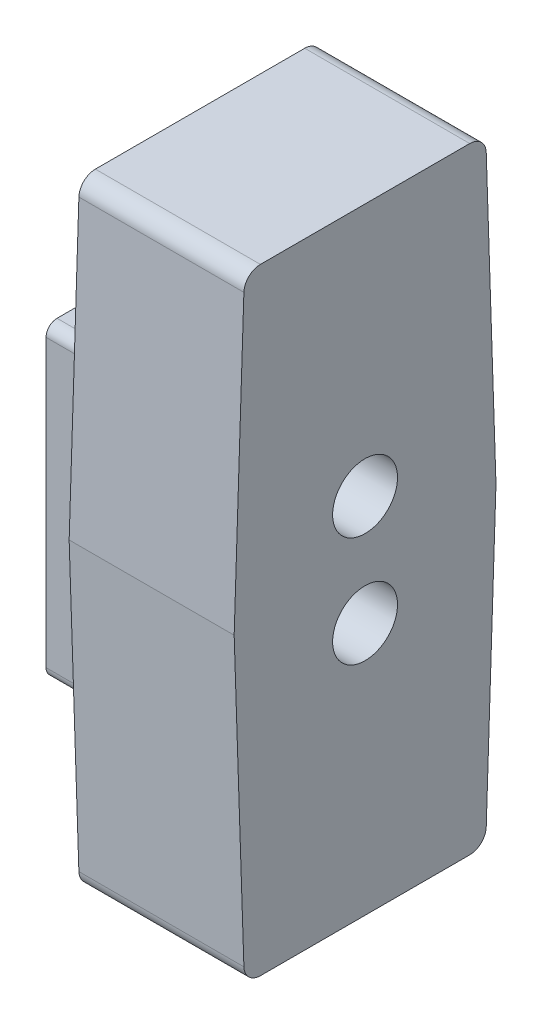
ISO-10303-21;
HEADER;
FILE_DESCRIPTION(('STEP AP214'),'2;1');
FILE_NAME('part.step','',(''),(''),'','','');
FILE_SCHEMA(('AUTOMOTIVE_DESIGN { 1 0 10303 214 1 1 1 1 }'));
ENDSEC;
DATA;
#1=APPLICATION_CONTEXT('core data for automotive mechanical design processes');
#2=APPLICATION_PROTOCOL_DEFINITION('international standard','automotive_design',2000,#1);
#3=PRODUCT_CONTEXT('',#1,'mechanical');
#4=PRODUCT('Part','Part','',(#3));
#5=PRODUCT_RELATED_PRODUCT_CATEGORY('part','',(#4));
#6=PRODUCT_DEFINITION_FORMATION('','',#4);
#7=PRODUCT_DEFINITION_CONTEXT('part definition',#1,'design');
#8=PRODUCT_DEFINITION('design','',#6,#7);
#9=PRODUCT_DEFINITION_SHAPE('','',#8);
#10=(LENGTH_UNIT() NAMED_UNIT(*) SI_UNIT(.MILLI.,.METRE.));
#11=(NAMED_UNIT(*) PLANE_ANGLE_UNIT() SI_UNIT($,.RADIAN.));
#12=(NAMED_UNIT(*) SI_UNIT($,.STERADIAN.) SOLID_ANGLE_UNIT());
#13=UNCERTAINTY_MEASURE_WITH_UNIT(LENGTH_MEASURE(1.E-05),#10,'distance_accuracy_value','');
#14=(GEOMETRIC_REPRESENTATION_CONTEXT(3) GLOBAL_UNCERTAINTY_ASSIGNED_CONTEXT((#13)) GLOBAL_UNIT_ASSIGNED_CONTEXT((#10,
#11,#12)) REPRESENTATION_CONTEXT('',''));
#15=CARTESIAN_POINT('',(0.,0.,0.));
#16=DIRECTION('',(0.,0.,1.));
#17=DIRECTION('',(1.,0.,0.));
#18=AXIS2_PLACEMENT_3D('',#15,#16,#17);
#19=CARTESIAN_POINT('',(0.,-13.462,0.));
#20=DIRECTION('',(1.,0.,0.));
#21=DIRECTION('',(0.,0.,-1.));
#22=AXIS2_PLACEMENT_3D('',#19,#20,#21);
#23=PLANE('',#22);
#24=CARTESIAN_POINT('',(0.,-13.462,0.));
#25=DIRECTION('',(1.,0.,0.));
#26=DIRECTION('',(0.,0.,-1.));
#27=AXIS2_PLACEMENT_3D('',#24,#25,#26);
#28=CIRCLE('',#27,0.381000000000001);
#29=CARTESIAN_POINT('',(0.,-13.843,0.));
#30=VERTEX_POINT('',#29);
#31=CARTESIAN_POINT('',(0.,-13.4746919372469,-0.380788543326764));
#32=VERTEX_POINT('',#31);
#33=EDGE_CURVE('E181',#30,#32,#28,.T.);
#34=ORIENTED_EDGE('',*,*,#33,.F.);
#35=DIRECTION('',(0.,0.,-1.));
#36=VECTOR('',#35,1.);
#37=CARTESIAN_POINT('',(0.,-13.843,4.83351517574958));
#38=LINE('',#37,#36);
#39=CARTESIAN_POINT('',(0.,-13.843,4.83351517574958));
#40=VERTEX_POINT('',#39);
#41=EDGE_CURVE('E194',#40,#30,#38,.T.);
#42=ORIENTED_EDGE('',*,*,#41,.F.);
#43=CARTESIAN_POINT('',(0.,-13.462,4.83351517574958));
#44=DIRECTION('',(1.,0.,0.));
#45=DIRECTION('',(0.,0.,-1.));
#46=AXIS2_PLACEMENT_3D('',#43,#44,#45);
#47=CIRCLE('',#46,0.381);
#48=CARTESIAN_POINT('',(0.,-13.4746919372469,5.21430371907635));
#49=VERTEX_POINT('',#48);
#50=EDGE_CURVE('E226',#49,#40,#47,.T.);
#51=ORIENTED_EDGE('',*,*,#50,.F.);
#52=DIRECTION('',(0.,-0.999444995608313,-0.0333121712516466));
#53=VECTOR('',#52,1.);
#54=CARTESIAN_POINT('',(0.,-6.731,5.43907548907775));
#55=LINE('',#54,#53);
#56=CARTESIAN_POINT('',(0.,-6.731,5.43907548907775));
#57=VERTEX_POINT('',#56);
#58=EDGE_CURVE('E224',#57,#49,#55,.T.);
#59=ORIENTED_EDGE('',*,*,#58,.F.);
#60=DIRECTION('',(0.,-0.999444995608313,0.0333121712516464));
#61=VECTOR('',#60,1.);
#62=CARTESIAN_POINT('',(0.,0.0126919372468769,5.21430371907635));
#63=LINE('',#62,#61);
#64=CARTESIAN_POINT('',(0.,0.0126919372468769,5.21430371907635));
#65=VERTEX_POINT('',#64);
#66=EDGE_CURVE('E222',#65,#57,#63,.T.);
#67=ORIENTED_EDGE('',*,*,#66,.F.);
#68=CARTESIAN_POINT('',(0.,0.,4.83351517574958));
#69=DIRECTION('',(1.,0.,0.));
#70=DIRECTION('',(0.,0.,-1.));
#71=AXIS2_PLACEMENT_3D('',#68,#69,#70);
#72=CIRCLE('',#71,0.381000000000001);
#73=CARTESIAN_POINT('',(0.,0.380999999999999,4.83351517574958));
#74=VERTEX_POINT('',#73);
#75=EDGE_CURVE('E220',#74,#65,#72,.T.);
#76=ORIENTED_EDGE('',*,*,#75,.F.);
#77=DIRECTION('',(0.,0.,1.));
#78=VECTOR('',#77,1.);
#79=CARTESIAN_POINT('',(0.,0.380999999999999,0.));
#80=LINE('',#79,#78);
#81=CARTESIAN_POINT('',(0.,0.381,0.));
#82=VERTEX_POINT('',#81);
#83=EDGE_CURVE('E218',#82,#74,#80,.T.);
#84=ORIENTED_EDGE('',*,*,#83,.F.);
#85=CARTESIAN_POINT('',(0.,0.,0.));
#86=DIRECTION('',(1.,0.,0.));
#87=DIRECTION('',(0.,0.,-1.));
#88=AXIS2_PLACEMENT_3D('',#85,#86,#87);
#89=CIRCLE('',#88,0.381);
#90=CARTESIAN_POINT('',(0.,0.0126919372468778,-0.380788543326767));
#91=VERTEX_POINT('',#90);
#92=EDGE_CURVE('E216',#91,#82,#89,.T.);
#93=ORIENTED_EDGE('',*,*,#92,.F.);
#94=DIRECTION('',(0.,0.999444995608313,0.0333121712516459));
#95=VECTOR('',#94,1.);
#96=CARTESIAN_POINT('',(0.,-6.731,-0.605560313328157));
#97=LINE('',#96,#95);
#98=CARTESIAN_POINT('',(0.,-6.731,-0.605560313328157));
#99=VERTEX_POINT('',#98);
#100=EDGE_CURVE('E214',#99,#91,#97,.T.);
#101=ORIENTED_EDGE('',*,*,#100,.F.);
#102=DIRECTION('',(0.,0.999444995608313,-0.0333121712516464));
#103=VECTOR('',#102,1.);
#104=CARTESIAN_POINT('',(0.,-13.4746919372469,-0.380788543326764));
#105=LINE('',#104,#103);
#106=EDGE_CURVE('E184',#32,#99,#105,.T.);
#107=ORIENTED_EDGE('',*,*,#106,.F.);
#108=EDGE_LOOP('',(#34,#42,#51,#59,#67,#76,#84,#93,#101,#107));
#109=FACE_BOUND('',#108,.T.);
#110=CARTESIAN_POINT('',(0.,-10.033,0.130757587874789));
#111=DIRECTION('',(-1.,0.,0.));
#112=DIRECTION('',(0.,0.,1.));
#113=AXIS2_PLACEMENT_3D('',#110,#111,#112);
#114=CIRCLE('',#113,0.254);
#115=CARTESIAN_POINT('',(0.,-10.033,-0.123242412125212));
#116=VERTEX_POINT('',#115);
#117=CARTESIAN_POINT('',(0.,-10.287,0.130757587874789));
#118=VERTEX_POINT('',#117);
#119=EDGE_CURVE('E180',#116,#118,#114,.T.);
#120=ORIENTED_EDGE('',*,*,#119,.F.);
#121=DIRECTION('',(0.,-1.,0.));
#122=VECTOR('',#121,1.);
#123=CARTESIAN_POINT('',(0.,-10.033,-0.123242412125212));
#124=LINE('',#123,#122);
#125=CARTESIAN_POINT('',(0.,-3.429,-0.123242412125213));
#126=VERTEX_POINT('',#125);
#127=EDGE_CURVE('E177',#126,#116,#124,.T.);
#128=ORIENTED_EDGE('',*,*,#127,.F.);
#129=CARTESIAN_POINT('',(0.,-3.429,0.130757587874788));
#130=DIRECTION('',(-1.,0.,0.));
#131=DIRECTION('',(0.,0.,1.));
#132=AXIS2_PLACEMENT_3D('',#129,#130,#131);
#133=CIRCLE('',#132,0.254000000000001);
#134=CARTESIAN_POINT('',(0.,-3.175,0.130757587874788));
#135=VERTEX_POINT('',#134);
#136=EDGE_CURVE('E289',#135,#126,#133,.T.);
#137=ORIENTED_EDGE('',*,*,#136,.F.);
#138=DIRECTION('',(0.,0.,-1.));
#139=VECTOR('',#138,1.);
#140=CARTESIAN_POINT('',(0.,-3.175,0.130757587874788));
#141=LINE('',#140,#139);
#142=CARTESIAN_POINT('',(0.,-3.175,4.70275758787479));
#143=VERTEX_POINT('',#142);
#144=EDGE_CURVE('E286',#143,#135,#141,.T.);
#145=ORIENTED_EDGE('',*,*,#144,.F.);
#146=CARTESIAN_POINT('',(0.,-3.429,4.70275758787479));
#147=DIRECTION('',(-1.,0.,0.));
#148=DIRECTION('',(0.,0.,-1.));
#149=AXIS2_PLACEMENT_3D('',#146,#147,#148);
#150=CIRCLE('',#149,0.254);
#151=CARTESIAN_POINT('',(0.,-3.429,4.95675758787479));
#152=VERTEX_POINT('',#151);
#153=EDGE_CURVE('E283',#152,#143,#150,.T.);
#154=ORIENTED_EDGE('',*,*,#153,.F.);
#155=DIRECTION('',(0.,1.,0.));
#156=VECTOR('',#155,1.);
#157=CARTESIAN_POINT('',(0.,-10.033,4.95675758787479));
#158=LINE('',#157,#156);
#159=CARTESIAN_POINT('',(0.,-10.033,4.95675758787479));
#160=VERTEX_POINT('',#159);
#161=EDGE_CURVE('E280',#160,#152,#158,.T.);
#162=ORIENTED_EDGE('',*,*,#161,.F.);
#163=CARTESIAN_POINT('',(0.,-10.033,4.70275758787479));
#164=DIRECTION('',(-1.,0.,0.));
#165=DIRECTION('',(0.,0.,1.));
#166=AXIS2_PLACEMENT_3D('',#163,#164,#165);
#167=CIRCLE('',#166,0.254);
#168=CARTESIAN_POINT('',(0.,-10.287,4.70275758787479));
#169=VERTEX_POINT('',#168);
#170=EDGE_CURVE('E55',#169,#160,#167,.T.);
#171=ORIENTED_EDGE('',*,*,#170,.F.);
#172=DIRECTION('',(0.,0.,1.));
#173=VECTOR('',#172,1.);
#174=CARTESIAN_POINT('',(0.,-10.287,0.130757587874789));
#175=LINE('',#174,#173);
#176=EDGE_CURVE('E50',#118,#169,#175,.T.);
#177=ORIENTED_EDGE('',*,*,#176,.F.);
#178=EDGE_LOOP('',(#120,#128,#137,#145,#154,#162,#171,#177));
#179=FACE_BOUND('',#178,.T.);
#180=ADVANCED_FACE('F33',(#109,#179),#23,.F.);
#181=CARTESIAN_POINT('',(3.81,-13.462,0.));
#182=DIRECTION('',(-1.,0.,0.));
#183=DIRECTION('',(0.,0.,1.));
#184=AXIS2_PLACEMENT_3D('',#181,#182,#183);
#185=CYLINDRICAL_SURFACE('',#184,0.381000000000001);
#186=ORIENTED_EDGE('',*,*,#33,.T.);
#187=DIRECTION('',(-1.,0.,0.));
#188=VECTOR('',#187,1.);
#189=CARTESIAN_POINT('',(3.81,-13.4746919372469,-0.380788543326764));
#190=LINE('',#189,#188);
#191=CARTESIAN_POINT('',(3.81,-13.4746919372469,-0.380788543326764));
#192=VERTEX_POINT('',#191);
#193=EDGE_CURVE('E11',#192,#32,#190,.T.);
#194=ORIENTED_EDGE('',*,*,#193,.F.);
#195=CARTESIAN_POINT('',(3.81,-13.462,0.));
#196=DIRECTION('',(1.,0.,0.));
#197=DIRECTION('',(0.,0.,-1.));
#198=AXIS2_PLACEMENT_3D('',#195,#196,#197);
#199=CIRCLE('',#198,0.381000000000001);
#200=CARTESIAN_POINT('',(3.81,-13.843,0.));
#201=VERTEX_POINT('',#200);
#202=EDGE_CURVE('E190',#201,#192,#199,.T.);
#203=ORIENTED_EDGE('',*,*,#202,.F.);
#204=DIRECTION('',(-1.,0.,0.));
#205=VECTOR('',#204,1.);
#206=CARTESIAN_POINT('',(3.81,-13.843,0.));
#207=LINE('',#206,#205);
#208=EDGE_CURVE('E211',#201,#30,#207,.T.);
#209=ORIENTED_EDGE('',*,*,#208,.T.);
#210=EDGE_LOOP('',(#186,#194,#203,#209));
#211=FACE_BOUND('',#210,.T.);
#212=ADVANCED_FACE('F35',(#211),#185,.T.);
#213=CARTESIAN_POINT('',(3.81,-13.4746919372469,-0.380788543326764));
#214=DIRECTION('',(0.,0.0333121712516464,0.999444995608313));
#215=DIRECTION('',(0.,-0.999444995608313,0.0333121712516464));
#216=AXIS2_PLACEMENT_3D('',#213,#214,#215);
#217=PLANE('',#216);
#218=ORIENTED_EDGE('',*,*,#106,.T.);
#219=DIRECTION('',(-1.,0.,0.));
#220=VECTOR('',#219,1.);
#221=CARTESIAN_POINT('',(3.81,-6.731,-0.605560313328157));
#222=LINE('',#221,#220);
#223=CARTESIAN_POINT('',(3.81,-6.731,-0.605560313328157));
#224=VERTEX_POINT('',#223);
#225=EDGE_CURVE('E42',#224,#99,#222,.T.);
#226=ORIENTED_EDGE('',*,*,#225,.F.);
#227=DIRECTION('',(0.,0.999444995608313,-0.0333121712516464));
#228=VECTOR('',#227,1.);
#229=CARTESIAN_POINT('',(3.81,-13.4746919372469,-0.380788543326764));
#230=LINE('',#229,#228);
#231=EDGE_CURVE('E193',#192,#224,#230,.T.);
#232=ORIENTED_EDGE('',*,*,#231,.F.);
#233=ORIENTED_EDGE('',*,*,#193,.T.);
#234=EDGE_LOOP('',(#218,#226,#232,#233));
#235=FACE_BOUND('',#234,.T.);
#236=ADVANCED_FACE('F334',(#235),#217,.F.);
#237=CARTESIAN_POINT('',(3.81,-6.731,-0.605560313328157));
#238=DIRECTION('',(0.,-0.0333121712516459,0.999444995608313));
#239=DIRECTION('',(0.,-0.999444995608313,-0.0333121712516459));
#240=AXIS2_PLACEMENT_3D('',#237,#238,#239);
#241=PLANE('',#240);
#242=ORIENTED_EDGE('',*,*,#100,.T.);
#243=DIRECTION('',(-1.,0.,0.));
#244=VECTOR('',#243,1.);
#245=CARTESIAN_POINT('',(3.81,0.0126919372468778,-0.380788543326767));
#246=LINE('',#245,#244);
#247=CARTESIAN_POINT('',(3.81,0.0126919372468778,-0.380788543326767));
#248=VERTEX_POINT('',#247);
#249=EDGE_CURVE('E249',#248,#91,#246,.T.);
#250=ORIENTED_EDGE('',*,*,#249,.F.);
#251=DIRECTION('',(0.,0.999444995608313,0.0333121712516459));
#252=VECTOR('',#251,1.);
#253=CARTESIAN_POINT('',(3.81,-6.731,-0.605560313328157));
#254=LINE('',#253,#252);
#255=EDGE_CURVE('E196',#224,#248,#254,.T.);
#256=ORIENTED_EDGE('',*,*,#255,.F.);
#257=ORIENTED_EDGE('',*,*,#225,.T.);
#258=EDGE_LOOP('',(#242,#250,#256,#257));
#259=FACE_BOUND('',#258,.T.);
#260=ADVANCED_FACE('F368',(#259),#241,.F.);
#261=CARTESIAN_POINT('',(3.81,0.,0.));
#262=DIRECTION('',(-1.,0.,0.));
#263=DIRECTION('',(0.,0.,1.));
#264=AXIS2_PLACEMENT_3D('',#261,#262,#263);
#265=CYLINDRICAL_SURFACE('',#264,0.381);
#266=ORIENTED_EDGE('',*,*,#92,.T.);
#267=DIRECTION('',(-1.,0.,0.));
#268=VECTOR('',#267,1.);
#269=CARTESIAN_POINT('',(3.81,0.381,0.));
#270=LINE('',#269,#268);
#271=CARTESIAN_POINT('',(3.81,0.381,0.));
#272=VERTEX_POINT('',#271);
#273=EDGE_CURVE('E246',#272,#82,#270,.T.);
#274=ORIENTED_EDGE('',*,*,#273,.F.);
#275=CARTESIAN_POINT('',(3.81,0.,0.));
#276=DIRECTION('',(1.,0.,0.));
#277=DIRECTION('',(0.,0.,-1.));
#278=AXIS2_PLACEMENT_3D('',#275,#276,#277);
#279=CIRCLE('',#278,0.381);
#280=EDGE_CURVE('E198',#248,#272,#279,.T.);
#281=ORIENTED_EDGE('',*,*,#280,.F.);
#282=ORIENTED_EDGE('',*,*,#249,.T.);
#283=EDGE_LOOP('',(#266,#274,#281,#282));
#284=FACE_BOUND('',#283,.T.);
#285=ADVANCED_FACE('F364',(#284),#265,.T.);
#286=CARTESIAN_POINT('',(3.81,0.380999999999999,0.));
#287=DIRECTION('',(0.,-1.,0.));
#288=DIRECTION('',(0.,0.,-1.));
#289=AXIS2_PLACEMENT_3D('',#286,#287,#288);
#290=PLANE('',#289);
#291=ORIENTED_EDGE('',*,*,#83,.T.);
#292=DIRECTION('',(-1.,0.,0.));
#293=VECTOR('',#292,1.);
#294=CARTESIAN_POINT('',(3.81,0.380999999999999,4.83351517574958));
#295=LINE('',#294,#293);
#296=CARTESIAN_POINT('',(3.81,0.380999999999999,4.83351517574958));
#297=VERTEX_POINT('',#296);
#298=EDGE_CURVE('E243',#297,#74,#295,.T.);
#299=ORIENTED_EDGE('',*,*,#298,.F.);
#300=DIRECTION('',(0.,0.,1.));
#301=VECTOR('',#300,1.);
#302=CARTESIAN_POINT('',(3.81,0.380999999999999,0.));
#303=LINE('',#302,#301);
#304=EDGE_CURVE('E200',#272,#297,#303,.T.);
#305=ORIENTED_EDGE('',*,*,#304,.F.);
#306=ORIENTED_EDGE('',*,*,#273,.T.);
#307=EDGE_LOOP('',(#291,#299,#305,#306));
#308=FACE_BOUND('',#307,.T.);
#309=ADVANCED_FACE('F360',(#308),#290,.F.);
#310=CARTESIAN_POINT('',(3.81,0.,4.83351517574958));
#311=DIRECTION('',(-1.,0.,0.));
#312=DIRECTION('',(0.,0.,1.));
#313=AXIS2_PLACEMENT_3D('',#310,#311,#312);
#314=CYLINDRICAL_SURFACE('',#313,0.381000000000001);
#315=ORIENTED_EDGE('',*,*,#75,.T.);
#316=DIRECTION('',(-1.,0.,0.));
#317=VECTOR('',#316,1.);
#318=CARTESIAN_POINT('',(3.81,0.0126919372468769,5.21430371907635));
#319=LINE('',#318,#317);
#320=CARTESIAN_POINT('',(3.81,0.0126919372468769,5.21430371907635));
#321=VERTEX_POINT('',#320);
#322=EDGE_CURVE('E240',#321,#65,#319,.T.);
#323=ORIENTED_EDGE('',*,*,#322,.F.);
#324=CARTESIAN_POINT('',(3.81,0.,4.83351517574958));
#325=DIRECTION('',(1.,0.,0.));
#326=DIRECTION('',(0.,0.,-1.));
#327=AXIS2_PLACEMENT_3D('',#324,#325,#326);
#328=CIRCLE('',#327,0.381000000000001);
#329=EDGE_CURVE('E202',#297,#321,#328,.T.);
#330=ORIENTED_EDGE('',*,*,#329,.F.);
#331=ORIENTED_EDGE('',*,*,#298,.T.);
#332=EDGE_LOOP('',(#315,#323,#330,#331));
#333=FACE_BOUND('',#332,.T.);
#334=ADVANCED_FACE('F356',(#333),#314,.T.);
#335=CARTESIAN_POINT('',(3.81,0.0126919372468769,5.21430371907635));
#336=DIRECTION('',(0.,-0.0333121712516464,-0.999444995608313));
#337=DIRECTION('',(0.,0.999444995608313,-0.0333121712516464));
#338=AXIS2_PLACEMENT_3D('',#335,#336,#337);
#339=PLANE('',#338);
#340=ORIENTED_EDGE('',*,*,#66,.T.);
#341=DIRECTION('',(-1.,0.,0.));
#342=VECTOR('',#341,1.);
#343=CARTESIAN_POINT('',(3.81,-6.731,5.43907548907775));
#344=LINE('',#343,#342);
#345=CARTESIAN_POINT('',(3.81,-6.731,5.43907548907775));
#346=VERTEX_POINT('',#345);
#347=EDGE_CURVE('E237',#346,#57,#344,.T.);
#348=ORIENTED_EDGE('',*,*,#347,.F.);
#349=DIRECTION('',(0.,-0.999444995608313,0.0333121712516464));
#350=VECTOR('',#349,1.);
#351=CARTESIAN_POINT('',(3.81,0.0126919372468769,5.21430371907635));
#352=LINE('',#351,#350);
#353=EDGE_CURVE('E204',#321,#346,#352,.T.);
#354=ORIENTED_EDGE('',*,*,#353,.F.);
#355=ORIENTED_EDGE('',*,*,#322,.T.);
#356=EDGE_LOOP('',(#340,#348,#354,#355));
#357=FACE_BOUND('',#356,.T.);
#358=ADVANCED_FACE('F352',(#357),#339,.F.);
#359=CARTESIAN_POINT('',(3.81,-6.731,5.43907548907775));
#360=DIRECTION('',(0.,0.0333121712516466,-0.999444995608313));
#361=DIRECTION('',(0.,0.999444995608313,0.0333121712516466));
#362=AXIS2_PLACEMENT_3D('',#359,#360,#361);
#363=PLANE('',#362);
#364=ORIENTED_EDGE('',*,*,#58,.T.);
#365=DIRECTION('',(-1.,0.,0.));
#366=VECTOR('',#365,1.);
#367=CARTESIAN_POINT('',(3.81,-13.4746919372469,5.21430371907635));
#368=LINE('',#367,#366);
#369=CARTESIAN_POINT('',(3.81,-13.4746919372469,5.21430371907635));
#370=VERTEX_POINT('',#369);
#371=EDGE_CURVE('E234',#370,#49,#368,.T.);
#372=ORIENTED_EDGE('',*,*,#371,.F.);
#373=DIRECTION('',(0.,-0.999444995608313,-0.0333121712516466));
#374=VECTOR('',#373,1.);
#375=CARTESIAN_POINT('',(3.81,-6.731,5.43907548907775));
#376=LINE('',#375,#374);
#377=EDGE_CURVE('E206',#346,#370,#376,.T.);
#378=ORIENTED_EDGE('',*,*,#377,.F.);
#379=ORIENTED_EDGE('',*,*,#347,.T.);
#380=EDGE_LOOP('',(#364,#372,#378,#379));
#381=FACE_BOUND('',#380,.T.);
#382=ADVANCED_FACE('F348',(#381),#363,.F.);
#383=CARTESIAN_POINT('',(3.81,-13.462,4.83351517574958));
#384=DIRECTION('',(-1.,0.,0.));
#385=DIRECTION('',(0.,0.,1.));
#386=AXIS2_PLACEMENT_3D('',#383,#384,#385);
#387=CYLINDRICAL_SURFACE('',#386,0.381);
#388=ORIENTED_EDGE('',*,*,#50,.T.);
#389=DIRECTION('',(-1.,0.,0.));
#390=VECTOR('',#389,1.);
#391=CARTESIAN_POINT('',(3.81,-13.843,4.83351517574958));
#392=LINE('',#391,#390);
#393=CARTESIAN_POINT('',(3.81,-13.843,4.83351517574958));
#394=VERTEX_POINT('',#393);
#395=EDGE_CURVE('E231',#394,#40,#392,.T.);
#396=ORIENTED_EDGE('',*,*,#395,.F.);
#397=CARTESIAN_POINT('',(3.81,-13.462,4.83351517574958));
#398=DIRECTION('',(1.,0.,0.));
#399=DIRECTION('',(0.,0.,-1.));
#400=AXIS2_PLACEMENT_3D('',#397,#398,#399);
#401=CIRCLE('',#400,0.381);
#402=EDGE_CURVE('E208',#370,#394,#401,.T.);
#403=ORIENTED_EDGE('',*,*,#402,.F.);
#404=ORIENTED_EDGE('',*,*,#371,.T.);
#405=EDGE_LOOP('',(#388,#396,#403,#404));
#406=FACE_BOUND('',#405,.T.);
#407=ADVANCED_FACE('F344',(#406),#387,.T.);
#408=CARTESIAN_POINT('',(3.81,-13.843,4.83351517574958));
#409=DIRECTION('',(0.,1.,0.));
#410=DIRECTION('',(0.,0.,1.));
#411=AXIS2_PLACEMENT_3D('',#408,#409,#410);
#412=PLANE('',#411);
#413=ORIENTED_EDGE('',*,*,#41,.T.);
#414=ORIENTED_EDGE('',*,*,#208,.F.);
#415=DIRECTION('',(0.,0.,-1.));
#416=VECTOR('',#415,1.);
#417=CARTESIAN_POINT('',(3.81,-13.843,4.83351517574958));
#418=LINE('',#417,#416);
#419=EDGE_CURVE('E210',#394,#201,#418,.T.);
#420=ORIENTED_EDGE('',*,*,#419,.F.);
#421=ORIENTED_EDGE('',*,*,#395,.T.);
#422=EDGE_LOOP('',(#413,#414,#420,#421));
#423=FACE_BOUND('',#422,.T.);
#424=ADVANCED_FACE('F341',(#423),#412,.F.);
#425=CARTESIAN_POINT('',(3.81,-13.462,0.));
#426=DIRECTION('',(1.,0.,0.));
#427=DIRECTION('',(0.,0.,-1.));
#428=AXIS2_PLACEMENT_3D('',#425,#426,#427);
#429=PLANE('',#428);
#430=CARTESIAN_POINT('',(3.81,-8.001,2.41675758787479));
#431=DIRECTION('',(-1.,0.,0.));
#432=DIRECTION('',(0.,0.,1.));
#433=AXIS2_PLACEMENT_3D('',#430,#431,#432);
#434=CIRCLE('',#433,0.75);
#435=CARTESIAN_POINT('',(3.81,-8.001,3.16675758787479));
#436=VERTEX_POINT('',#435);
#437=EDGE_CURVE('E264',#436,#436,#434,.T.);
#438=ORIENTED_EDGE('',*,*,#437,.T.);
#439=EDGE_LOOP('',(#438));
#440=FACE_BOUND('',#439,.T.);
#441=CARTESIAN_POINT('',(3.81,-5.461,2.41675758787479));
#442=DIRECTION('',(-1.,0.,0.));
#443=DIRECTION('',(0.,0.,1.));
#444=AXIS2_PLACEMENT_3D('',#441,#442,#443);
#445=CIRCLE('',#444,0.75);
#446=CARTESIAN_POINT('',(3.81,-5.461,3.16675758787479));
#447=VERTEX_POINT('',#446);
#448=EDGE_CURVE('E255',#447,#447,#445,.T.);
#449=ORIENTED_EDGE('',*,*,#448,.T.);
#450=EDGE_LOOP('',(#449));
#451=FACE_BOUND('',#450,.T.);
#452=ORIENTED_EDGE('',*,*,#202,.T.);
#453=ORIENTED_EDGE('',*,*,#231,.T.);
#454=ORIENTED_EDGE('',*,*,#255,.T.);
#455=ORIENTED_EDGE('',*,*,#280,.T.);
#456=ORIENTED_EDGE('',*,*,#304,.T.);
#457=ORIENTED_EDGE('',*,*,#329,.T.);
#458=ORIENTED_EDGE('',*,*,#353,.T.);
#459=ORIENTED_EDGE('',*,*,#377,.T.);
#460=ORIENTED_EDGE('',*,*,#402,.T.);
#461=ORIENTED_EDGE('',*,*,#419,.T.);
#462=EDGE_LOOP('',(#452,#453,#454,#455,#456,#457,#458,#459,#460,#461));
#463=FACE_BOUND('',#462,.T.);
#464=ADVANCED_FACE('F339',(#440,#451,#463),#429,.T.);
#465=CARTESIAN_POINT('',(-1.016,-10.033,0.130757587874789));
#466=DIRECTION('',(1.,0.,0.));
#467=DIRECTION('',(0.,0.,-1.));
#468=AXIS2_PLACEMENT_3D('',#465,#466,#467);
#469=CYLINDRICAL_SURFACE('',#468,0.254);
#470=ORIENTED_EDGE('',*,*,#119,.T.);
#471=DIRECTION('',(1.,0.,0.));
#472=VECTOR('',#471,1.);
#473=CARTESIAN_POINT('',(-1.016,-10.287,0.130757587874789));
#474=LINE('',#473,#472);
#475=CARTESIAN_POINT('',(-1.016,-10.287,0.130757587874789));
#476=VERTEX_POINT('',#475);
#477=EDGE_CURVE('E161',#476,#118,#474,.T.);
#478=ORIENTED_EDGE('',*,*,#477,.F.);
#479=CARTESIAN_POINT('',(-1.016,-10.033,0.130757587874789));
#480=DIRECTION('',(-1.,0.,0.));
#481=DIRECTION('',(0.,0.,1.));
#482=AXIS2_PLACEMENT_3D('',#479,#480,#481);
#483=CIRCLE('',#482,0.254);
#484=CARTESIAN_POINT('',(-1.016,-10.033,-0.123242412125212));
#485=VERTEX_POINT('',#484);
#486=EDGE_CURVE('E168',#485,#476,#483,.T.);
#487=ORIENTED_EDGE('',*,*,#486,.F.);
#488=DIRECTION('',(1.,0.,0.));
#489=VECTOR('',#488,1.);
#490=CARTESIAN_POINT('',(-1.016,-10.033,-0.123242412125212));
#491=LINE('',#490,#489);
#492=EDGE_CURVE('E276',#485,#116,#491,.T.);
#493=ORIENTED_EDGE('',*,*,#492,.T.);
#494=EDGE_LOOP('',(#470,#478,#487,#493));
#495=FACE_BOUND('',#494,.T.);
#496=ADVANCED_FACE('F179',(#495),#469,.T.);
#497=CARTESIAN_POINT('',(-1.016,-10.287,0.130757587874789));
#498=DIRECTION('',(0.,1.,0.));
#499=DIRECTION('',(0.,0.,1.));
#500=AXIS2_PLACEMENT_3D('',#497,#498,#499);
#501=PLANE('',#500);
#502=ORIENTED_EDGE('',*,*,#176,.T.);
#503=DIRECTION('',(1.,0.,0.));
#504=VECTOR('',#503,1.);
#505=CARTESIAN_POINT('',(-1.016,-10.287,4.70275758787479));
#506=LINE('',#505,#504);
#507=CARTESIAN_POINT('',(-1.016,-10.287,4.70275758787479));
#508=VERTEX_POINT('',#507);
#509=EDGE_CURVE('E164',#508,#169,#506,.T.);
#510=ORIENTED_EDGE('',*,*,#509,.F.);
#511=DIRECTION('',(0.,0.,1.));
#512=VECTOR('',#511,1.);
#513=CARTESIAN_POINT('',(-1.016,-10.287,0.130757587874789));
#514=LINE('',#513,#512);
#515=EDGE_CURVE('E157',#476,#508,#514,.T.);
#516=ORIENTED_EDGE('',*,*,#515,.F.);
#517=ORIENTED_EDGE('',*,*,#477,.T.);
#518=EDGE_LOOP('',(#502,#510,#516,#517));
#519=FACE_BOUND('',#518,.T.);
#520=ADVANCED_FACE('F159',(#519),#501,.F.);
#521=CARTESIAN_POINT('',(-1.016,-10.033,4.70275758787479));
#522=DIRECTION('',(1.,0.,0.));
#523=DIRECTION('',(0.,0.,-1.));
#524=AXIS2_PLACEMENT_3D('',#521,#522,#523);
#525=CYLINDRICAL_SURFACE('',#524,0.254);
#526=ORIENTED_EDGE('',*,*,#170,.T.);
#527=DIRECTION('',(1.,0.,0.));
#528=VECTOR('',#527,1.);
#529=CARTESIAN_POINT('',(-1.016,-10.033,4.95675758787479));
#530=LINE('',#529,#528);
#531=CARTESIAN_POINT('',(-1.016,-10.033,4.95675758787479));
#532=VERTEX_POINT('',#531);
#533=EDGE_CURVE('E186',#532,#160,#530,.T.);
#534=ORIENTED_EDGE('',*,*,#533,.F.);
#535=CARTESIAN_POINT('',(-1.016,-10.033,4.70275758787479));
#536=DIRECTION('',(-1.,0.,0.));
#537=DIRECTION('',(0.,0.,1.));
#538=AXIS2_PLACEMENT_3D('',#535,#536,#537);
#539=CIRCLE('',#538,0.254);
#540=EDGE_CURVE('E167',#508,#532,#539,.T.);
#541=ORIENTED_EDGE('',*,*,#540,.F.);
#542=ORIENTED_EDGE('',*,*,#509,.T.);
#543=EDGE_LOOP('',(#526,#534,#541,#542));
#544=FACE_BOUND('',#543,.T.);
#545=ADVANCED_FACE('F313',(#544),#525,.T.);
#546=CARTESIAN_POINT('',(-1.016,-10.033,4.95675758787479));
#547=DIRECTION('',(0.,0.,-1.));
#548=DIRECTION('',(-1.,0.,0.));
#549=AXIS2_PLACEMENT_3D('',#546,#547,#548);
#550=PLANE('',#549);
#551=ORIENTED_EDGE('',*,*,#161,.T.);
#552=DIRECTION('',(1.,0.,0.));
#553=VECTOR('',#552,1.);
#554=CARTESIAN_POINT('',(-1.016,-3.429,4.95675758787479));
#555=LINE('',#554,#553);
#556=CARTESIAN_POINT('',(-1.016,-3.429,4.95675758787479));
#557=VERTEX_POINT('',#556);
#558=EDGE_CURVE('E304',#557,#152,#555,.T.);
#559=ORIENTED_EDGE('',*,*,#558,.F.);
#560=DIRECTION('',(0.,1.,0.));
#561=VECTOR('',#560,1.);
#562=CARTESIAN_POINT('',(-1.016,-10.033,4.95675758787479));
#563=LINE('',#562,#561);
#564=EDGE_CURVE('E268',#532,#557,#563,.T.);
#565=ORIENTED_EDGE('',*,*,#564,.F.);
#566=ORIENTED_EDGE('',*,*,#533,.T.);
#567=EDGE_LOOP('',(#551,#559,#565,#566));
#568=FACE_BOUND('',#567,.T.);
#569=ADVANCED_FACE('F310',(#568),#550,.F.);
#570=CARTESIAN_POINT('',(-1.016,-3.429,4.70275758787479));
#571=DIRECTION('',(1.,0.,0.));
#572=DIRECTION('',(0.,0.,-1.));
#573=AXIS2_PLACEMENT_3D('',#570,#571,#572);
#574=CYLINDRICAL_SURFACE('',#573,0.254);
#575=ORIENTED_EDGE('',*,*,#153,.T.);
#576=DIRECTION('',(1.,0.,0.));
#577=VECTOR('',#576,1.);
#578=CARTESIAN_POINT('',(-1.016,-3.175,4.70275758787479));
#579=LINE('',#578,#577);
#580=CARTESIAN_POINT('',(-1.016,-3.175,4.70275758787479));
#581=VERTEX_POINT('',#580);
#582=EDGE_CURVE('E301',#581,#143,#579,.T.);
#583=ORIENTED_EDGE('',*,*,#582,.F.);
#584=CARTESIAN_POINT('',(-1.016,-3.429,4.70275758787479));
#585=DIRECTION('',(-1.,0.,0.));
#586=DIRECTION('',(0.,0.,-1.));
#587=AXIS2_PLACEMENT_3D('',#584,#585,#586);
#588=CIRCLE('',#587,0.254);
#589=EDGE_CURVE('E270',#557,#581,#588,.T.);
#590=ORIENTED_EDGE('',*,*,#589,.F.);
#591=ORIENTED_EDGE('',*,*,#558,.T.);
#592=EDGE_LOOP('',(#575,#583,#590,#591));
#593=FACE_BOUND('',#592,.T.);
#594=ADVANCED_FACE('F317',(#593),#574,.T.);
#595=CARTESIAN_POINT('',(-1.016,-3.175,0.130757587874788));
#596=DIRECTION('',(0.,-1.,0.));
#597=DIRECTION('',(0.,0.,-1.));
#598=AXIS2_PLACEMENT_3D('',#595,#596,#597);
#599=PLANE('',#598);
#600=ORIENTED_EDGE('',*,*,#144,.T.);
#601=DIRECTION('',(1.,0.,0.));
#602=VECTOR('',#601,1.);
#603=CARTESIAN_POINT('',(-1.016,-3.175,0.130757587874788));
#604=LINE('',#603,#602);
#605=CARTESIAN_POINT('',(-1.016,-3.175,0.130757587874788));
#606=VERTEX_POINT('',#605);
#607=EDGE_CURVE('E298',#606,#135,#604,.T.);
#608=ORIENTED_EDGE('',*,*,#607,.F.);
#609=DIRECTION('',(0.,0.,-1.));
#610=VECTOR('',#609,1.);
#611=CARTESIAN_POINT('',(-1.016,-3.175,0.130757587874788));
#612=LINE('',#611,#610);
#613=EDGE_CURVE('E272',#581,#606,#612,.T.);
#614=ORIENTED_EDGE('',*,*,#613,.F.);
#615=ORIENTED_EDGE('',*,*,#582,.T.);
#616=EDGE_LOOP('',(#600,#608,#614,#615));
#617=FACE_BOUND('',#616,.T.);
#618=ADVANCED_FACE('F321',(#617),#599,.F.);
#619=CARTESIAN_POINT('',(-1.016,-3.429,0.130757587874788));
#620=DIRECTION('',(1.,0.,0.));
#621=DIRECTION('',(0.,0.,-1.));
#622=AXIS2_PLACEMENT_3D('',#619,#620,#621);
#623=CYLINDRICAL_SURFACE('',#622,0.254000000000001);
#624=ORIENTED_EDGE('',*,*,#136,.T.);
#625=DIRECTION('',(1.,0.,0.));
#626=VECTOR('',#625,1.);
#627=CARTESIAN_POINT('',(-1.016,-3.429,-0.123242412125213));
#628=LINE('',#627,#626);
#629=CARTESIAN_POINT('',(-1.016,-3.429,-0.123242412125213));
#630=VERTEX_POINT('',#629);
#631=EDGE_CURVE('E295',#630,#126,#628,.T.);
#632=ORIENTED_EDGE('',*,*,#631,.F.);
#633=CARTESIAN_POINT('',(-1.016,-3.429,0.130757587874788));
#634=DIRECTION('',(-1.,0.,0.));
#635=DIRECTION('',(0.,0.,1.));
#636=AXIS2_PLACEMENT_3D('',#633,#634,#635);
#637=CIRCLE('',#636,0.254000000000001);
#638=EDGE_CURVE('E274',#606,#630,#637,.T.);
#639=ORIENTED_EDGE('',*,*,#638,.F.);
#640=ORIENTED_EDGE('',*,*,#607,.T.);
#641=EDGE_LOOP('',(#624,#632,#639,#640));
#642=FACE_BOUND('',#641,.T.);
#643=ADVANCED_FACE('F325',(#642),#623,.T.);
#644=CARTESIAN_POINT('',(-1.016,-10.033,-0.123242412125212));
#645=DIRECTION('',(0.,0.,1.));
#646=DIRECTION('',(0.,-1.,0.));
#647=AXIS2_PLACEMENT_3D('',#644,#645,#646);
#648=PLANE('',#647);
#649=ORIENTED_EDGE('',*,*,#127,.T.);
#650=ORIENTED_EDGE('',*,*,#492,.F.);
#651=DIRECTION('',(0.,-1.,0.));
#652=VECTOR('',#651,1.);
#653=CARTESIAN_POINT('',(-1.016,-10.033,-0.123242412125212));
#654=LINE('',#653,#652);
#655=EDGE_CURVE('E173',#630,#485,#654,.T.);
#656=ORIENTED_EDGE('',*,*,#655,.F.);
#657=ORIENTED_EDGE('',*,*,#631,.T.);
#658=EDGE_LOOP('',(#649,#650,#656,#657));
#659=FACE_BOUND('',#658,.T.);
#660=ADVANCED_FACE('F327',(#659),#648,.F.);
#661=CARTESIAN_POINT('',(-1.016,-10.033,0.130757587874789));
#662=DIRECTION('',(-1.,0.,0.));
#663=DIRECTION('',(0.,0.,1.));
#664=AXIS2_PLACEMENT_3D('',#661,#662,#663);
#665=PLANE('',#664);
#666=CARTESIAN_POINT('',(-1.016,-8.001,2.41675758787479));
#667=DIRECTION('',(-1.,0.,0.));
#668=DIRECTION('',(0.,0.,1.));
#669=AXIS2_PLACEMENT_3D('',#666,#667,#668);
#670=CIRCLE('',#669,0.75);
#671=CARTESIAN_POINT('',(-1.016,-8.001,3.16675758787479));
#672=VERTEX_POINT('',#671);
#673=EDGE_CURVE('E37',#672,#672,#670,.T.);
#674=ORIENTED_EDGE('',*,*,#673,.F.);
#675=EDGE_LOOP('',(#674));
#676=FACE_BOUND('',#675,.T.);
#677=CARTESIAN_POINT('',(-1.016,-5.461,2.41675758787479));
#678=DIRECTION('',(-1.,0.,0.));
#679=DIRECTION('',(0.,0.,1.));
#680=AXIS2_PLACEMENT_3D('',#677,#678,#679);
#681=CIRCLE('',#680,0.75);
#682=CARTESIAN_POINT('',(-1.016,-5.461,3.16675758787479));
#683=VERTEX_POINT('',#682);
#684=EDGE_CURVE('E253',#683,#683,#681,.T.);
#685=ORIENTED_EDGE('',*,*,#684,.F.);
#686=EDGE_LOOP('',(#685));
#687=FACE_BOUND('',#686,.T.);
#688=ORIENTED_EDGE('',*,*,#486,.T.);
#689=ORIENTED_EDGE('',*,*,#515,.T.);
#690=ORIENTED_EDGE('',*,*,#540,.T.);
#691=ORIENTED_EDGE('',*,*,#564,.T.);
#692=ORIENTED_EDGE('',*,*,#589,.T.);
#693=ORIENTED_EDGE('',*,*,#613,.T.);
#694=ORIENTED_EDGE('',*,*,#638,.T.);
#695=ORIENTED_EDGE('',*,*,#655,.T.);
#696=EDGE_LOOP('',(#688,#689,#690,#691,#692,#693,#694,#695));
#697=FACE_BOUND('',#696,.T.);
#698=ADVANCED_FACE('F171',(#676,#687,#697),#665,.T.);
#699=CARTESIAN_POINT('',(3.81,-5.461,2.41675758787479));
#700=DIRECTION('',(-1.,0.,0.));
#701=DIRECTION('',(0.,0.,1.));
#702=AXIS2_PLACEMENT_3D('',#699,#700,#701);
#703=CYLINDRICAL_SURFACE('',#702,0.75);
#704=ORIENTED_EDGE('',*,*,#684,.T.);
#705=EDGE_LOOP('',(#704));
#706=FACE_BOUND('',#705,.T.);
#707=ORIENTED_EDGE('',*,*,#448,.F.);
#708=EDGE_LOOP('',(#707));
#709=FACE_BOUND('',#708,.T.);
#710=ADVANCED_FACE('F414',(#706,#709),#703,.F.);
#711=CARTESIAN_POINT('',(3.81,-8.001,2.41675758787479));
#712=DIRECTION('',(-1.,0.,0.));
#713=DIRECTION('',(0.,0.,1.));
#714=AXIS2_PLACEMENT_3D('',#711,#712,#713);
#715=CYLINDRICAL_SURFACE('',#714,0.75);
#716=ORIENTED_EDGE('',*,*,#673,.T.);
#717=EDGE_LOOP('',(#716));
#718=FACE_BOUND('',#717,.T.);
#719=ORIENTED_EDGE('',*,*,#437,.F.);
#720=EDGE_LOOP('',(#719));
#721=FACE_BOUND('',#720,.T.);
#722=ADVANCED_FACE('F412',(#718,#721),#715,.F.);
#723=CLOSED_SHELL('',(#180,#212,#236,#260,#285,#309,#334,#358,#382,#407,#424,#464,#496,#520,
#545,#569,#594,#618,#643,#660,#698,#710,#722));
#724=MANIFOLD_SOLID_BREP('B2',#723);
#725=ADVANCED_BREP_SHAPE_REPRESENTATION('',(#18,#724),#14);
#726=SHAPE_DEFINITION_REPRESENTATION(#9,#725);
ENDSEC;
END-ISO-10303-21;
